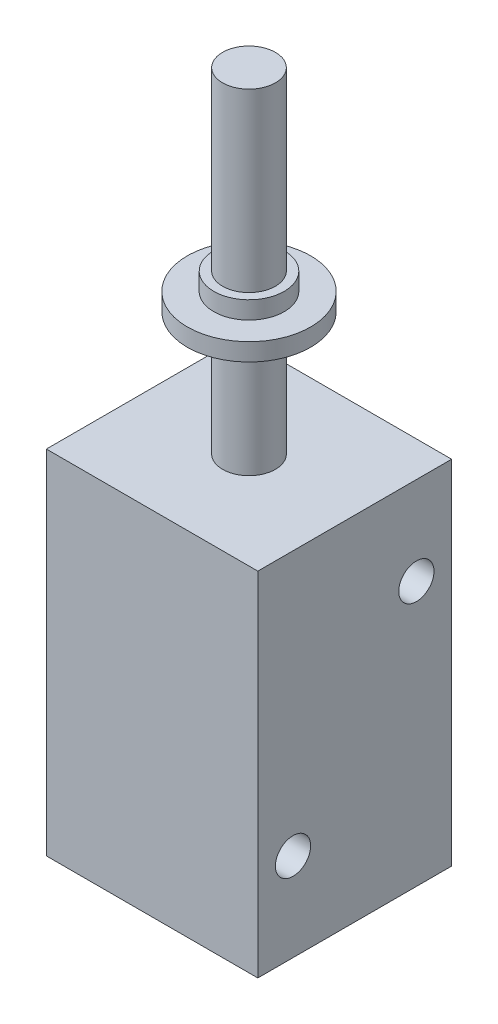
ISO-10303-21;
HEADER;
FILE_DESCRIPTION(('STEP AP214'),'2;1');
FILE_NAME('part.step','',(''),(''),'','','');
FILE_SCHEMA(('AUTOMOTIVE_DESIGN { 1 0 10303 214 1 1 1 1 }'));
ENDSEC;
DATA;
#1=APPLICATION_CONTEXT('core data for automotive mechanical design processes');
#2=APPLICATION_PROTOCOL_DEFINITION('international standard','automotive_design',2000,#1);
#3=PRODUCT_CONTEXT('',#1,'mechanical');
#4=PRODUCT('Part','Part','',(#3));
#5=PRODUCT_RELATED_PRODUCT_CATEGORY('part','',(#4));
#6=PRODUCT_DEFINITION_FORMATION('','',#4);
#7=PRODUCT_DEFINITION_CONTEXT('part definition',#1,'design');
#8=PRODUCT_DEFINITION('design','',#6,#7);
#9=PRODUCT_DEFINITION_SHAPE('','',#8);
#10=(LENGTH_UNIT() NAMED_UNIT(*) SI_UNIT(.MILLI.,.METRE.));
#11=(NAMED_UNIT(*) PLANE_ANGLE_UNIT() SI_UNIT($,.RADIAN.));
#12=(NAMED_UNIT(*) SI_UNIT($,.STERADIAN.) SOLID_ANGLE_UNIT());
#13=UNCERTAINTY_MEASURE_WITH_UNIT(LENGTH_MEASURE(1.E-05),#10,'distance_accuracy_value','');
#14=(GEOMETRIC_REPRESENTATION_CONTEXT(3) GLOBAL_UNCERTAINTY_ASSIGNED_CONTEXT((#13)) GLOBAL_UNIT_ASSIGNED_CONTEXT((#10,
#11,#12)) REPRESENTATION_CONTEXT('',''));
#15=CARTESIAN_POINT('',(0.,0.,0.));
#16=DIRECTION('',(0.,0.,1.));
#17=DIRECTION('',(1.,0.,0.));
#18=AXIS2_PLACEMENT_3D('',#15,#16,#17);
#19=CARTESIAN_POINT('',(6.,39.,-5.5));
#20=DIRECTION('',(0.,-1.,0.));
#21=DIRECTION('',(0.,0.,-1.));
#22=AXIS2_PLACEMENT_3D('',#19,#20,#21);
#23=CYLINDRICAL_SURFACE('',#22,1.5);
#24=CARTESIAN_POINT('',(6.,20.,-5.5));
#25=DIRECTION('',(0.,1.,0.));
#26=DIRECTION('',(0.,0.,1.));
#27=AXIS2_PLACEMENT_3D('',#24,#25,#26);
#28=CIRCLE('',#27,1.5);
#29=CARTESIAN_POINT('',(6.,20.,-4.));
#30=VERTEX_POINT('',#29);
#31=EDGE_CURVE('E46',#30,#30,#28,.T.);
#32=ORIENTED_EDGE('',*,*,#31,.T.);
#33=EDGE_LOOP('',(#32));
#34=FACE_BOUND('',#33,.T.);
#35=CARTESIAN_POINT('',(6.,27.,-5.5));
#36=DIRECTION('',(0.,1.,0.));
#37=DIRECTION('',(0.,0.,1.));
#38=AXIS2_PLACEMENT_3D('',#35,#36,#37);
#39=CIRCLE('',#38,1.5);
#40=CARTESIAN_POINT('',(6.,27.,-4.));
#41=VERTEX_POINT('',#40);
#42=EDGE_CURVE('E11',#41,#41,#39,.T.);
#43=ORIENTED_EDGE('',*,*,#42,.F.);
#44=EDGE_LOOP('',(#43));
#45=FACE_BOUND('',#44,.T.);
#46=ADVANCED_FACE('F36',(#34,#45),#23,.T.);
#47=CARTESIAN_POINT('',(0.,20.,0.));
#48=DIRECTION('',(1.,0.,0.));
#49=DIRECTION('',(0.,0.,-1.));
#50=AXIS2_PLACEMENT_3D('',#47,#48,#49);
#51=PLANE('',#50);
#52=CARTESIAN_POINT('',(0.,5.,-2.));
#53=DIRECTION('',(1.,0.,0.));
#54=DIRECTION('',(0.,0.,-1.));
#55=AXIS2_PLACEMENT_3D('',#52,#53,#54);
#56=CIRCLE('',#55,1.);
#57=CARTESIAN_POINT('',(0.,5.,-3.));
#58=VERTEX_POINT('',#57);
#59=EDGE_CURVE('E131',#58,#58,#56,.F.);
#60=ORIENTED_EDGE('',*,*,#59,.F.);
#61=EDGE_LOOP('',(#60));
#62=FACE_BOUND('',#61,.T.);
#63=CARTESIAN_POINT('',(0.,15.,-9.));
#64=DIRECTION('',(1.,0.,0.));
#65=DIRECTION('',(0.,0.,-1.));
#66=AXIS2_PLACEMENT_3D('',#63,#64,#65);
#67=CIRCLE('',#66,0.999999999999999);
#68=CARTESIAN_POINT('',(0.,15.,-10.));
#69=VERTEX_POINT('',#68);
#70=EDGE_CURVE('E138',#69,#69,#67,.F.);
#71=ORIENTED_EDGE('',*,*,#70,.F.);
#72=EDGE_LOOP('',(#71));
#73=FACE_BOUND('',#72,.T.);
#74=DIRECTION('',(0.,0.,1.));
#75=VECTOR('',#74,1.);
#76=CARTESIAN_POINT('',(0.,0.,0.));
#77=LINE('',#76,#75);
#78=CARTESIAN_POINT('',(0.,0.,-11.));
#79=VERTEX_POINT('',#78);
#80=CARTESIAN_POINT('',(0.,0.,0.));
#81=VERTEX_POINT('',#80);
#82=EDGE_CURVE('E105',#79,#81,#77,.T.);
#83=ORIENTED_EDGE('',*,*,#82,.T.);
#84=DIRECTION('',(0.,-1.,0.));
#85=VECTOR('',#84,1.);
#86=CARTESIAN_POINT('',(0.,20.,0.));
#87=LINE('',#86,#85);
#88=CARTESIAN_POINT('',(0.,20.,0.));
#89=VERTEX_POINT('',#88);
#90=EDGE_CURVE('E96',#89,#81,#87,.T.);
#91=ORIENTED_EDGE('',*,*,#90,.F.);
#92=DIRECTION('',(0.,0.,1.));
#93=VECTOR('',#92,1.);
#94=CARTESIAN_POINT('',(0.,20.,0.));
#95=LINE('',#94,#93);
#96=CARTESIAN_POINT('',(0.,20.,-11.));
#97=VERTEX_POINT('',#96);
#98=EDGE_CURVE('E90',#97,#89,#95,.T.);
#99=ORIENTED_EDGE('',*,*,#98,.F.);
#100=DIRECTION('',(0.,-1.,0.));
#101=VECTOR('',#100,1.);
#102=CARTESIAN_POINT('',(0.,20.,-11.));
#103=LINE('',#102,#101);
#104=EDGE_CURVE('E101',#97,#79,#103,.T.);
#105=ORIENTED_EDGE('',*,*,#104,.T.);
#106=EDGE_LOOP('',(#83,#91,#99,#105));
#107=FACE_BOUND('',#106,.T.);
#108=ADVANCED_FACE('F38',(#62,#73,#107),#51,.F.);
#109=CARTESIAN_POINT('',(0.,20.,0.));
#110=DIRECTION('',(0.,0.,-1.));
#111=DIRECTION('',(-1.,0.,0.));
#112=AXIS2_PLACEMENT_3D('',#109,#110,#111);
#113=PLANE('',#112);
#114=DIRECTION('',(1.,0.,0.));
#115=VECTOR('',#114,1.);
#116=CARTESIAN_POINT('',(0.,0.,0.));
#117=LINE('',#116,#115);
#118=CARTESIAN_POINT('',(12.,0.,0.));
#119=VERTEX_POINT('',#118);
#120=EDGE_CURVE('E95',#81,#119,#117,.T.);
#121=ORIENTED_EDGE('',*,*,#120,.T.);
#122=DIRECTION('',(0.,-1.,0.));
#123=VECTOR('',#122,1.);
#124=CARTESIAN_POINT('',(12.,20.,0.));
#125=LINE('',#124,#123);
#126=CARTESIAN_POINT('',(12.,20.,0.));
#127=VERTEX_POINT('',#126);
#128=EDGE_CURVE('E93',#127,#119,#125,.T.);
#129=ORIENTED_EDGE('',*,*,#128,.F.);
#130=DIRECTION('',(1.,0.,0.));
#131=VECTOR('',#130,1.);
#132=CARTESIAN_POINT('',(0.,20.,0.));
#133=LINE('',#132,#131);
#134=EDGE_CURVE('E85',#89,#127,#133,.T.);
#135=ORIENTED_EDGE('',*,*,#134,.F.);
#136=ORIENTED_EDGE('',*,*,#90,.T.);
#137=EDGE_LOOP('',(#121,#129,#135,#136));
#138=FACE_BOUND('',#137,.T.);
#139=ADVANCED_FACE('F94',(#138),#113,.F.);
#140=CARTESIAN_POINT('',(12.,20.,0.));
#141=DIRECTION('',(-1.,0.,0.));
#142=DIRECTION('',(0.,0.,1.));
#143=AXIS2_PLACEMENT_3D('',#140,#141,#142);
#144=PLANE('',#143);
#145=CARTESIAN_POINT('',(12.,5.,-2.));
#146=DIRECTION('',(1.,0.,0.));
#147=DIRECTION('',(0.,0.,-1.));
#148=AXIS2_PLACEMENT_3D('',#145,#146,#147);
#149=CIRCLE('',#148,1.);
#150=CARTESIAN_POINT('',(12.,5.,-3.));
#151=VERTEX_POINT('',#150);
#152=EDGE_CURVE('E137',#151,#151,#149,.T.);
#153=ORIENTED_EDGE('',*,*,#152,.F.);
#154=EDGE_LOOP('',(#153));
#155=FACE_BOUND('',#154,.T.);
#156=CARTESIAN_POINT('',(12.,15.,-9.));
#157=DIRECTION('',(1.,0.,0.));
#158=DIRECTION('',(0.,0.,-1.));
#159=AXIS2_PLACEMENT_3D('',#156,#157,#158);
#160=CIRCLE('',#159,0.999999999999999);
#161=CARTESIAN_POINT('',(12.,15.,-10.));
#162=VERTEX_POINT('',#161);
#163=EDGE_CURVE('E134',#162,#162,#160,.T.);
#164=ORIENTED_EDGE('',*,*,#163,.F.);
#165=EDGE_LOOP('',(#164));
#166=FACE_BOUND('',#165,.T.);
#167=DIRECTION('',(0.,0.,-1.));
#168=VECTOR('',#167,1.);
#169=CARTESIAN_POINT('',(12.,0.,0.));
#170=LINE('',#169,#168);
#171=CARTESIAN_POINT('',(12.,0.,-11.));
#172=VERTEX_POINT('',#171);
#173=EDGE_CURVE('E71',#119,#172,#170,.T.);
#174=ORIENTED_EDGE('',*,*,#173,.T.);
#175=DIRECTION('',(0.,-1.,0.));
#176=VECTOR('',#175,1.);
#177=CARTESIAN_POINT('',(12.,20.,-11.));
#178=LINE('',#177,#176);
#179=CARTESIAN_POINT('',(12.,20.,-11.));
#180=VERTEX_POINT('',#179);
#181=EDGE_CURVE('E97',#180,#172,#178,.T.);
#182=ORIENTED_EDGE('',*,*,#181,.F.);
#183=DIRECTION('',(0.,0.,-1.));
#184=VECTOR('',#183,1.);
#185=CARTESIAN_POINT('',(12.,20.,0.));
#186=LINE('',#185,#184);
#187=EDGE_CURVE('E88',#127,#180,#186,.T.);
#188=ORIENTED_EDGE('',*,*,#187,.F.);
#189=ORIENTED_EDGE('',*,*,#128,.T.);
#190=EDGE_LOOP('',(#174,#182,#188,#189));
#191=FACE_BOUND('',#190,.T.);
#192=ADVANCED_FACE('F99',(#155,#166,#191),#144,.F.);
#193=CARTESIAN_POINT('',(0.,20.,-11.));
#194=DIRECTION('',(0.,0.,1.));
#195=DIRECTION('',(1.,0.,0.));
#196=AXIS2_PLACEMENT_3D('',#193,#194,#195);
#197=PLANE('',#196);
#198=DIRECTION('',(-1.,0.,0.));
#199=VECTOR('',#198,1.);
#200=CARTESIAN_POINT('',(0.,0.,-11.));
#201=LINE('',#200,#199);
#202=EDGE_CURVE('E77',#172,#79,#201,.T.);
#203=ORIENTED_EDGE('',*,*,#202,.T.);
#204=ORIENTED_EDGE('',*,*,#104,.F.);
#205=DIRECTION('',(-1.,0.,0.));
#206=VECTOR('',#205,1.);
#207=CARTESIAN_POINT('',(0.,20.,-11.));
#208=LINE('',#207,#206);
#209=EDGE_CURVE('E54',#180,#97,#208,.T.);
#210=ORIENTED_EDGE('',*,*,#209,.F.);
#211=ORIENTED_EDGE('',*,*,#181,.T.);
#212=EDGE_LOOP('',(#203,#204,#210,#211));
#213=FACE_BOUND('',#212,.T.);
#214=ADVANCED_FACE('F150',(#213),#197,.F.);
#215=CARTESIAN_POINT('',(0.,20.,0.));
#216=DIRECTION('',(0.,-1.,0.));
#217=DIRECTION('',(0.,0.,-1.));
#218=AXIS2_PLACEMENT_3D('',#215,#216,#217);
#219=PLANE('',#218);
#220=ORIENTED_EDGE('',*,*,#31,.F.);
#221=EDGE_LOOP('',(#220));
#222=FACE_BOUND('',#221,.T.);
#223=ORIENTED_EDGE('',*,*,#98,.T.);
#224=ORIENTED_EDGE('',*,*,#134,.T.);
#225=ORIENTED_EDGE('',*,*,#187,.T.);
#226=ORIENTED_EDGE('',*,*,#209,.T.);
#227=EDGE_LOOP('',(#223,#224,#225,#226));
#228=FACE_BOUND('',#227,.T.);
#229=ADVANCED_FACE('F86',(#222,#228),#219,.F.);
#230=CARTESIAN_POINT('',(0.,0.,0.));
#231=DIRECTION('',(0.,-1.,0.));
#232=DIRECTION('',(0.,0.,-1.));
#233=AXIS2_PLACEMENT_3D('',#230,#231,#232);
#234=PLANE('',#233);
#235=ORIENTED_EDGE('',*,*,#82,.F.);
#236=ORIENTED_EDGE('',*,*,#202,.F.);
#237=ORIENTED_EDGE('',*,*,#173,.F.);
#238=ORIENTED_EDGE('',*,*,#120,.F.);
#239=EDGE_LOOP('',(#235,#236,#237,#238));
#240=FACE_BOUND('',#239,.T.);
#241=ADVANCED_FACE('F181',(#240),#234,.T.);
#242=CARTESIAN_POINT('',(6.,28.,-5.5));
#243=DIRECTION('',(0.,-1.,0.));
#244=DIRECTION('',(0.,0.,-1.));
#245=AXIS2_PLACEMENT_3D('',#242,#243,#244);
#246=CYLINDRICAL_SURFACE('',#245,3.5);
#247=CARTESIAN_POINT('',(6.,28.,-5.5));
#248=DIRECTION('',(0.,1.,0.));
#249=DIRECTION('',(0.,0.,1.));
#250=AXIS2_PLACEMENT_3D('',#247,#248,#249);
#251=CIRCLE('',#250,3.5);
#252=CARTESIAN_POINT('',(6.,28.,-2.));
#253=VERTEX_POINT('',#252);
#254=EDGE_CURVE('E121',#253,#253,#251,.T.);
#255=ORIENTED_EDGE('',*,*,#254,.F.);
#256=EDGE_LOOP('',(#255));
#257=FACE_BOUND('',#256,.T.);
#258=CARTESIAN_POINT('',(6.,27.,-5.5));
#259=DIRECTION('',(0.,1.,0.));
#260=DIRECTION('',(0.,0.,1.));
#261=AXIS2_PLACEMENT_3D('',#258,#259,#260);
#262=CIRCLE('',#261,3.5);
#263=CARTESIAN_POINT('',(6.,27.,-2.));
#264=VERTEX_POINT('',#263);
#265=EDGE_CURVE('E122',#264,#264,#262,.T.);
#266=ORIENTED_EDGE('',*,*,#265,.T.);
#267=EDGE_LOOP('',(#266));
#268=FACE_BOUND('',#267,.T.);
#269=ADVANCED_FACE('F185',(#257,#268),#246,.T.);
#270=CARTESIAN_POINT('',(6.,28.,-5.5));
#271=DIRECTION('',(0.,1.,0.));
#272=DIRECTION('',(0.,0.,1.));
#273=AXIS2_PLACEMENT_3D('',#270,#271,#272);
#274=PLANE('',#273);
#275=CARTESIAN_POINT('',(6.,28.,-5.5));
#276=DIRECTION('',(0.,1.,0.));
#277=DIRECTION('',(0.,0.,1.));
#278=AXIS2_PLACEMENT_3D('',#275,#276,#277);
#279=CIRCLE('',#278,2.);
#280=CARTESIAN_POINT('',(6.,28.,-3.5));
#281=VERTEX_POINT('',#280);
#282=EDGE_CURVE('E127',#281,#281,#279,.T.);
#283=ORIENTED_EDGE('',*,*,#282,.F.);
#284=EDGE_LOOP('',(#283));
#285=FACE_BOUND('',#284,.T.);
#286=ORIENTED_EDGE('',*,*,#254,.T.);
#287=EDGE_LOOP('',(#286));
#288=FACE_BOUND('',#287,.T.);
#289=ADVANCED_FACE('F219',(#285,#288),#274,.T.);
#290=CARTESIAN_POINT('',(6.,27.,-5.5));
#291=DIRECTION('',(0.,1.,0.));
#292=DIRECTION('',(0.,0.,1.));
#293=AXIS2_PLACEMENT_3D('',#290,#291,#292);
#294=PLANE('',#293);
#295=ORIENTED_EDGE('',*,*,#42,.T.);
#296=EDGE_LOOP('',(#295));
#297=FACE_BOUND('',#296,.T.);
#298=ORIENTED_EDGE('',*,*,#265,.F.);
#299=EDGE_LOOP('',(#298));
#300=FACE_BOUND('',#299,.T.);
#301=ADVANCED_FACE('F227',(#297,#300),#294,.F.);
#302=CARTESIAN_POINT('',(6.,29.,-5.5));
#303=DIRECTION('',(0.,-1.,0.));
#304=DIRECTION('',(0.,0.,-1.));
#305=AXIS2_PLACEMENT_3D('',#302,#303,#304);
#306=CYLINDRICAL_SURFACE('',#305,2.);
#307=CARTESIAN_POINT('',(6.,29.,-5.5));
#308=DIRECTION('',(0.,1.,0.));
#309=DIRECTION('',(0.,0.,1.));
#310=AXIS2_PLACEMENT_3D('',#307,#308,#309);
#311=CIRCLE('',#310,2.);
#312=CARTESIAN_POINT('',(6.,29.,-3.5));
#313=VERTEX_POINT('',#312);
#314=EDGE_CURVE('E130',#313,#313,#311,.T.);
#315=ORIENTED_EDGE('',*,*,#314,.F.);
#316=EDGE_LOOP('',(#315));
#317=FACE_BOUND('',#316,.T.);
#318=ORIENTED_EDGE('',*,*,#282,.T.);
#319=EDGE_LOOP('',(#318));
#320=FACE_BOUND('',#319,.T.);
#321=ADVANCED_FACE('F235',(#317,#320),#306,.T.);
#322=CARTESIAN_POINT('',(6.,29.,-5.5));
#323=DIRECTION('',(0.,1.,0.));
#324=DIRECTION('',(0.,0.,1.));
#325=AXIS2_PLACEMENT_3D('',#322,#323,#324);
#326=PLANE('',#325);
#327=CARTESIAN_POINT('',(6.,29.,-5.5));
#328=DIRECTION('',(0.,1.,0.));
#329=DIRECTION('',(0.,0.,1.));
#330=AXIS2_PLACEMENT_3D('',#327,#328,#329);
#331=CIRCLE('',#330,1.5);
#332=CARTESIAN_POINT('',(6.,29.,-4.));
#333=VERTEX_POINT('',#332);
#334=EDGE_CURVE('E40',#333,#333,#331,.T.);
#335=ORIENTED_EDGE('',*,*,#334,.F.);
#336=EDGE_LOOP('',(#335));
#337=FACE_BOUND('',#336,.T.);
#338=ORIENTED_EDGE('',*,*,#314,.T.);
#339=EDGE_LOOP('',(#338));
#340=FACE_BOUND('',#339,.T.);
#341=ADVANCED_FACE('F242',(#337,#340),#326,.T.);
#342=CARTESIAN_POINT('',(6.,39.,-5.5));
#343=DIRECTION('',(0.,1.,0.));
#344=DIRECTION('',(0.,0.,1.));
#345=AXIS2_PLACEMENT_3D('',#342,#343,#344);
#346=PLANE('',#345);
#347=CARTESIAN_POINT('',(6.,39.,-5.5));
#348=DIRECTION('',(0.,1.,0.));
#349=DIRECTION('',(0.,0.,1.));
#350=AXIS2_PLACEMENT_3D('',#347,#348,#349);
#351=CIRCLE('',#350,1.5);
#352=CARTESIAN_POINT('',(6.,39.,-4.));
#353=VERTEX_POINT('',#352);
#354=EDGE_CURVE('E108',#353,#353,#351,.T.);
#355=ORIENTED_EDGE('',*,*,#354,.T.);
#356=EDGE_LOOP('',(#355));
#357=FACE_BOUND('',#356,.T.);
#358=ADVANCED_FACE('F165',(#357),#346,.T.);
#359=ORIENTED_EDGE('',*,*,#334,.T.);
#360=EDGE_LOOP('',(#359));
#361=FACE_BOUND('',#360,.T.);
#362=ORIENTED_EDGE('',*,*,#354,.F.);
#363=EDGE_LOOP('',(#362));
#364=FACE_BOUND('',#363,.T.);
#365=ADVANCED_FACE('F156',(#361,#364),#23,.T.);
#366=CARTESIAN_POINT('',(-2.82842712474619,15.,-9.));
#367=DIRECTION('',(1.,0.,0.));
#368=DIRECTION('',(0.,0.,-1.));
#369=AXIS2_PLACEMENT_3D('',#366,#367,#368);
#370=CYLINDRICAL_SURFACE('',#369,0.999999999999999);
#371=ORIENTED_EDGE('',*,*,#70,.T.);
#372=EDGE_LOOP('',(#371));
#373=FACE_BOUND('',#372,.T.);
#374=ORIENTED_EDGE('',*,*,#163,.T.);
#375=EDGE_LOOP('',(#374));
#376=FACE_BOUND('',#375,.T.);
#377=ADVANCED_FACE('F154',(#373,#376),#370,.F.);
#378=CARTESIAN_POINT('',(-2.82842712474619,5.,-2.));
#379=DIRECTION('',(1.,0.,0.));
#380=DIRECTION('',(0.,0.,-1.));
#381=AXIS2_PLACEMENT_3D('',#378,#379,#380);
#382=CYLINDRICAL_SURFACE('',#381,1.);
#383=ORIENTED_EDGE('',*,*,#59,.T.);
#384=EDGE_LOOP('',(#383));
#385=FACE_BOUND('',#384,.T.);
#386=ORIENTED_EDGE('',*,*,#152,.T.);
#387=EDGE_LOOP('',(#386));
#388=FACE_BOUND('',#387,.T.);
#389=ADVANCED_FACE('F146',(#385,#388),#382,.F.);
#390=CLOSED_SHELL('',(#46,#108,#139,#192,#214,#229,#241,#269,#289,#301,#321,#341,#358,#365,#377,#389));
#391=MANIFOLD_SOLID_BREP('B2',#390);
#392=ADVANCED_BREP_SHAPE_REPRESENTATION('',(#18,#391),#14);
#393=SHAPE_DEFINITION_REPRESENTATION(#9,#392);
ENDSEC;
END-ISO-10303-21;
